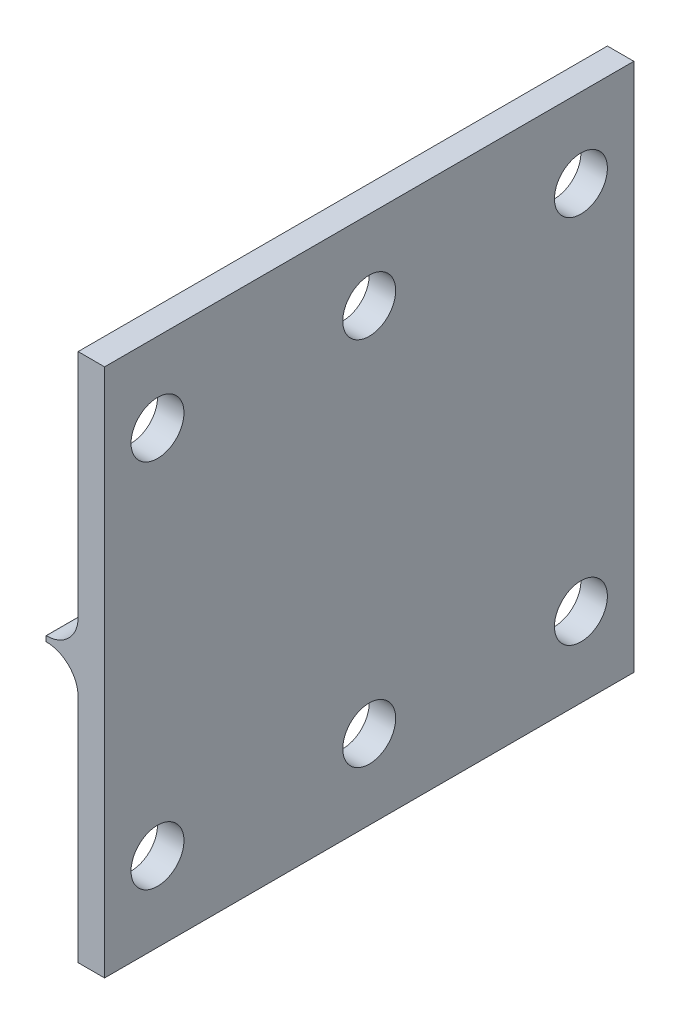
ISO-10303-21;
HEADER;
FILE_DESCRIPTION(('STEP AP214'),'2;1');
FILE_NAME('part.step','',(''),(''),'','','');
FILE_SCHEMA(('AUTOMOTIVE_DESIGN { 1 0 10303 214 1 1 1 1 }'));
ENDSEC;
DATA;
#1=APPLICATION_CONTEXT('core data for automotive mechanical design processes');
#2=APPLICATION_PROTOCOL_DEFINITION('international standard','automotive_design',2000,#1);
#3=PRODUCT_CONTEXT('',#1,'mechanical');
#4=PRODUCT('Part','Part','',(#3));
#5=PRODUCT_RELATED_PRODUCT_CATEGORY('part','',(#4));
#6=PRODUCT_DEFINITION_FORMATION('','',#4);
#7=PRODUCT_DEFINITION_CONTEXT('part definition',#1,'design');
#8=PRODUCT_DEFINITION('design','',#6,#7);
#9=PRODUCT_DEFINITION_SHAPE('','',#8);
#10=(LENGTH_UNIT() NAMED_UNIT(*) SI_UNIT(.MILLI.,.METRE.));
#11=(NAMED_UNIT(*) PLANE_ANGLE_UNIT() SI_UNIT($,.RADIAN.));
#12=(NAMED_UNIT(*) SI_UNIT($,.STERADIAN.) SOLID_ANGLE_UNIT());
#13=UNCERTAINTY_MEASURE_WITH_UNIT(LENGTH_MEASURE(1.E-05),#10,'distance_accuracy_value','');
#14=(GEOMETRIC_REPRESENTATION_CONTEXT(3) GLOBAL_UNCERTAINTY_ASSIGNED_CONTEXT((#13)) GLOBAL_UNIT_ASSIGNED_CONTEXT((#10,
#11,#12)) REPRESENTATION_CONTEXT('',''));
#15=CARTESIAN_POINT('',(0.,0.,0.));
#16=DIRECTION('',(0.,0.,1.));
#17=DIRECTION('',(1.,0.,0.));
#18=AXIS2_PLACEMENT_3D('',#15,#16,#17);
#19=CARTESIAN_POINT('',(-25.,447.529481132075,500.));
#20=DIRECTION('',(1.,0.,0.));
#21=DIRECTION('',(0.,1.,0.));
#22=AXIS2_PLACEMENT_3D('',#19,#20,#21);
#23=PLANE('',#22);
#24=CARTESIAN_POINT('',(-24.9999999999999,372.529481132073,49.999999999999));
#25=DIRECTION('',(-1.,0.,0.));
#26=DIRECTION('',(0.,0.,1.));
#27=AXIS2_PLACEMENT_3D('',#24,#25,#26);
#28=CIRCLE('',#27,25.);
#29=CARTESIAN_POINT('',(-24.9999999999999,372.529481132073,74.999999999999));
#30=VERTEX_POINT('',#29);
#31=EDGE_CURVE('E242',#30,#30,#28,.T.);
#32=ORIENTED_EDGE('',*,*,#31,.F.);
#33=EDGE_LOOP('',(#32));
#34=FACE_BOUND('',#33,.T.);
#35=CARTESIAN_POINT('',(-24.9999999999999,372.529481132074,249.999999999999));
#36=DIRECTION('',(-1.,0.,0.));
#37=DIRECTION('',(0.,0.,1.));
#38=AXIS2_PLACEMENT_3D('',#35,#36,#37);
#39=CIRCLE('',#38,25.);
#40=CARTESIAN_POINT('',(-24.9999999999999,372.529481132074,274.999999999999));
#41=VERTEX_POINT('',#40);
#42=EDGE_CURVE('E236',#41,#41,#39,.T.);
#43=ORIENTED_EDGE('',*,*,#42,.F.);
#44=EDGE_LOOP('',(#43));
#45=FACE_BOUND('',#44,.T.);
#46=CARTESIAN_POINT('',(-24.9999999999999,372.529481132075,449.999999999999));
#47=DIRECTION('',(-1.,0.,0.));
#48=DIRECTION('',(0.,0.,1.));
#49=AXIS2_PLACEMENT_3D('',#46,#47,#48);
#50=CIRCLE('',#49,25.);
#51=CARTESIAN_POINT('',(-24.9999999999999,372.529481132075,474.999999999999));
#52=VERTEX_POINT('',#51);
#53=EDGE_CURVE('E230',#52,#52,#50,.T.);
#54=ORIENTED_EDGE('',*,*,#53,.F.);
#55=EDGE_LOOP('',(#54));
#56=FACE_BOUND('',#55,.T.);
#57=DIRECTION('',(0.,-1.,0.));
#58=VECTOR('',#57,1.);
#59=CARTESIAN_POINT('',(-25.,447.529481132075,0.));
#60=LINE('',#59,#58);
#61=CARTESIAN_POINT('',(-25.,447.529481132075,0.));
#62=VERTEX_POINT('',#61);
#63=CARTESIAN_POINT('',(-25.,230.029481132075,0.));
#64=VERTEX_POINT('',#63);
#65=EDGE_CURVE('E145',#62,#64,#60,.T.);
#66=ORIENTED_EDGE('',*,*,#65,.T.);
#67=DIRECTION('',(0.,0.,-1.));
#68=VECTOR('',#67,1.);
#69=CARTESIAN_POINT('',(-25.,230.029481132075,500.));
#70=LINE('',#69,#68);
#71=CARTESIAN_POINT('',(-25.,230.029481132075,500.));
#72=VERTEX_POINT('',#71);
#73=EDGE_CURVE('E11',#72,#64,#70,.T.);
#74=ORIENTED_EDGE('',*,*,#73,.F.);
#75=DIRECTION('',(0.,-1.,0.));
#76=VECTOR('',#75,1.);
#77=CARTESIAN_POINT('',(-25.,447.529481132075,500.));
#78=LINE('',#77,#76);
#79=CARTESIAN_POINT('',(-25.,447.529481132075,500.));
#80=VERTEX_POINT('',#79);
#81=EDGE_CURVE('E165',#80,#72,#78,.T.);
#82=ORIENTED_EDGE('',*,*,#81,.F.);
#83=DIRECTION('',(0.,0.,-1.));
#84=VECTOR('',#83,1.);
#85=CARTESIAN_POINT('',(-25.,447.529481132075,500.));
#86=LINE('',#85,#84);
#87=EDGE_CURVE('E141',#80,#62,#86,.T.);
#88=ORIENTED_EDGE('',*,*,#87,.T.);
#89=EDGE_LOOP('',(#66,#74,#82,#88));
#90=FACE_BOUND('',#89,.T.);
#91=ADVANCED_FACE('F37',(#34,#45,#56,#90),#23,.F.);
#92=CARTESIAN_POINT('',(-55.,230.029481132075,500.));
#93=DIRECTION('',(0.,0.,-1.));
#94=DIRECTION('',(-1.,0.,0.));
#95=AXIS2_PLACEMENT_3D('',#92,#93,#94);
#96=CYLINDRICAL_SURFACE('',#95,30.);
#97=CARTESIAN_POINT('',(-55.,230.029481132075,0.));
#98=DIRECTION('',(0.,0.,-1.));
#99=DIRECTION('',(1.,0.,0.));
#100=AXIS2_PLACEMENT_3D('',#97,#98,#99);
#101=CIRCLE('',#100,30.);
#102=CARTESIAN_POINT('',(-55.,200.029481132075,0.));
#103=VERTEX_POINT('',#102);
#104=EDGE_CURVE('E148',#64,#103,#101,.T.);
#105=ORIENTED_EDGE('',*,*,#104,.T.);
#106=DIRECTION('',(0.,0.,-1.));
#107=VECTOR('',#106,1.);
#108=CARTESIAN_POINT('',(-55.,200.029481132075,500.));
#109=LINE('',#108,#107);
#110=CARTESIAN_POINT('',(-55.,200.029481132075,500.));
#111=VERTEX_POINT('',#110);
#112=EDGE_CURVE('E45',#111,#103,#109,.T.);
#113=ORIENTED_EDGE('',*,*,#112,.F.);
#114=CARTESIAN_POINT('',(-55.,230.029481132075,500.));
#115=DIRECTION('',(0.,0.,-1.));
#116=DIRECTION('',(1.,0.,0.));
#117=AXIS2_PLACEMENT_3D('',#114,#115,#116);
#118=CIRCLE('',#117,30.);
#119=EDGE_CURVE('E102',#72,#111,#118,.T.);
#120=ORIENTED_EDGE('',*,*,#119,.F.);
#121=ORIENTED_EDGE('',*,*,#73,.T.);
#122=EDGE_LOOP('',(#105,#113,#120,#121));
#123=FACE_BOUND('',#122,.T.);
#124=ADVANCED_FACE('F259',(#123),#96,.F.);
#125=CARTESIAN_POINT('',(-55.,200.029481132075,500.));
#126=DIRECTION('',(0.,-1.,0.));
#127=DIRECTION('',(0.,0.,-1.));
#128=AXIS2_PLACEMENT_3D('',#125,#126,#127);
#129=PLANE('',#128);
#130=DIRECTION('',(-1.,0.,0.));
#131=VECTOR('',#130,1.);
#132=CARTESIAN_POINT('',(-55.,200.029481132075,0.));
#133=LINE('',#132,#131);
#134=CARTESIAN_POINT('',(-55.1997775417419,200.029481132075,0.));
#135=VERTEX_POINT('',#134);
#136=EDGE_CURVE('E151',#103,#135,#133,.T.);
#137=ORIENTED_EDGE('',*,*,#136,.T.);
#138=DIRECTION('',(0.,0.,-1.));
#139=VECTOR('',#138,1.);
#140=CARTESIAN_POINT('',(-55.1997775417419,200.029481132075,500.));
#141=LINE('',#140,#139);
#142=CARTESIAN_POINT('',(-55.1997775417419,200.029481132075,500.));
#143=VERTEX_POINT('',#142);
#144=EDGE_CURVE('E178',#143,#135,#141,.T.);
#145=ORIENTED_EDGE('',*,*,#144,.F.);
#146=DIRECTION('',(-1.,0.,0.));
#147=VECTOR('',#146,1.);
#148=CARTESIAN_POINT('',(-55.,200.029481132075,500.));
#149=LINE('',#148,#147);
#150=EDGE_CURVE('E186',#111,#143,#149,.T.);
#151=ORIENTED_EDGE('',*,*,#150,.F.);
#152=ORIENTED_EDGE('',*,*,#112,.T.);
#153=EDGE_LOOP('',(#137,#145,#151,#152));
#154=FACE_BOUND('',#153,.T.);
#155=ADVANCED_FACE('F184',(#154),#129,.F.);
#156=CARTESIAN_POINT('',(-55.1997775417419,200.029481132075,500.));
#157=DIRECTION('',(1.,0.,0.));
#158=DIRECTION('',(0.,0.,-1.));
#159=AXIS2_PLACEMENT_3D('',#156,#157,#158);
#160=PLANE('',#159);
#161=DIRECTION('',(0.,-1.,0.));
#162=VECTOR('',#161,1.);
#163=CARTESIAN_POINT('',(-55.1997775417419,200.029481132075,0.));
#164=LINE('',#163,#162);
#165=CARTESIAN_POINT('',(-55.1997775417419,195.029481132075,0.));
#166=VERTEX_POINT('',#165);
#167=EDGE_CURVE('E153',#135,#166,#164,.T.);
#168=ORIENTED_EDGE('',*,*,#167,.T.);
#169=DIRECTION('',(0.,0.,-1.));
#170=VECTOR('',#169,1.);
#171=CARTESIAN_POINT('',(-55.1997775417419,195.029481132075,500.));
#172=LINE('',#171,#170);
#173=CARTESIAN_POINT('',(-55.1997775417419,195.029481132075,500.));
#174=VERTEX_POINT('',#173);
#175=EDGE_CURVE('E175',#174,#166,#172,.T.);
#176=ORIENTED_EDGE('',*,*,#175,.F.);
#177=DIRECTION('',(0.,-1.,0.));
#178=VECTOR('',#177,1.);
#179=CARTESIAN_POINT('',(-55.1997775417419,200.029481132075,500.));
#180=LINE('',#179,#178);
#181=EDGE_CURVE('E204',#143,#174,#180,.T.);
#182=ORIENTED_EDGE('',*,*,#181,.F.);
#183=ORIENTED_EDGE('',*,*,#144,.T.);
#184=EDGE_LOOP('',(#168,#176,#182,#183));
#185=FACE_BOUND('',#184,.T.);
#186=ADVANCED_FACE('F195',(#185),#160,.F.);
#187=CARTESIAN_POINT('',(-55.1997775417419,195.029481132075,500.));
#188=DIRECTION('',(0.,1.,0.));
#189=DIRECTION('',(0.,0.,1.));
#190=AXIS2_PLACEMENT_3D('',#187,#188,#189);
#191=PLANE('',#190);
#192=DIRECTION('',(1.,0.,0.));
#193=VECTOR('',#192,1.);
#194=CARTESIAN_POINT('',(-55.1997775417419,195.029481132075,0.));
#195=LINE('',#194,#193);
#196=CARTESIAN_POINT('',(-55.,195.029481132075,0.));
#197=VERTEX_POINT('',#196);
#198=EDGE_CURVE('E155',#166,#197,#195,.T.);
#199=ORIENTED_EDGE('',*,*,#198,.T.);
#200=DIRECTION('',(0.,0.,-1.));
#201=VECTOR('',#200,1.);
#202=CARTESIAN_POINT('',(-55.,195.029481132075,500.));
#203=LINE('',#202,#201);
#204=CARTESIAN_POINT('',(-55.,195.029481132075,500.));
#205=VERTEX_POINT('',#204);
#206=EDGE_CURVE('E172',#205,#197,#203,.T.);
#207=ORIENTED_EDGE('',*,*,#206,.F.);
#208=DIRECTION('',(1.,0.,0.));
#209=VECTOR('',#208,1.);
#210=CARTESIAN_POINT('',(-55.1997775417419,195.029481132075,500.));
#211=LINE('',#210,#209);
#212=EDGE_CURVE('E201',#174,#205,#211,.T.);
#213=ORIENTED_EDGE('',*,*,#212,.F.);
#214=ORIENTED_EDGE('',*,*,#175,.T.);
#215=EDGE_LOOP('',(#199,#207,#213,#214));
#216=FACE_BOUND('',#215,.T.);
#217=ADVANCED_FACE('F199',(#216),#191,.F.);
#218=CARTESIAN_POINT('',(-55.,165.029481132075,500.));
#219=DIRECTION('',(0.,0.,-1.));
#220=DIRECTION('',(-1.,0.,0.));
#221=AXIS2_PLACEMENT_3D('',#218,#219,#220);
#222=CYLINDRICAL_SURFACE('',#221,30.);
#223=CARTESIAN_POINT('',(-55.,165.029481132075,0.));
#224=DIRECTION('',(0.,0.,-1.));
#225=DIRECTION('',(1.,0.,0.));
#226=AXIS2_PLACEMENT_3D('',#223,#224,#225);
#227=CIRCLE('',#226,30.);
#228=CARTESIAN_POINT('',(-25.,165.029481132075,0.));
#229=VERTEX_POINT('',#228);
#230=EDGE_CURVE('E157',#197,#229,#227,.T.);
#231=ORIENTED_EDGE('',*,*,#230,.T.);
#232=DIRECTION('',(0.,0.,-1.));
#233=VECTOR('',#232,1.);
#234=CARTESIAN_POINT('',(-25.,165.029481132075,500.));
#235=LINE('',#234,#233);
#236=CARTESIAN_POINT('',(-25.,165.029481132075,500.));
#237=VERTEX_POINT('',#236);
#238=EDGE_CURVE('E169',#237,#229,#235,.T.);
#239=ORIENTED_EDGE('',*,*,#238,.F.);
#240=CARTESIAN_POINT('',(-55.,165.029481132075,500.));
#241=DIRECTION('',(0.,0.,-1.));
#242=DIRECTION('',(1.,0.,0.));
#243=AXIS2_PLACEMENT_3D('',#240,#241,#242);
#244=CIRCLE('',#243,30.);
#245=EDGE_CURVE('E203',#205,#237,#244,.T.);
#246=ORIENTED_EDGE('',*,*,#245,.F.);
#247=ORIENTED_EDGE('',*,*,#206,.T.);
#248=EDGE_LOOP('',(#231,#239,#246,#247));
#249=FACE_BOUND('',#248,.T.);
#250=ADVANCED_FACE('F269',(#249),#222,.F.);
#251=CARTESIAN_POINT('',(-24.9999999999999,0.,500.));
#252=DIRECTION('',(1.,0.,0.));
#253=DIRECTION('',(0.,0.,-1.));
#254=AXIS2_PLACEMENT_3D('',#251,#252,#253);
#255=PLANE('',#254);
#256=CARTESIAN_POINT('',(-24.9999999999999,22.5294811320727,50.0000000000002));
#257=DIRECTION('',(-1.,0.,0.));
#258=DIRECTION('',(0.,0.,1.));
#259=AXIS2_PLACEMENT_3D('',#256,#257,#258);
#260=CIRCLE('',#259,25.);
#261=CARTESIAN_POINT('',(-24.9999999999999,22.5294811320727,75.0000000000002));
#262=VERTEX_POINT('',#261);
#263=EDGE_CURVE('E224',#262,#262,#260,.T.);
#264=ORIENTED_EDGE('',*,*,#263,.F.);
#265=EDGE_LOOP('',(#264));
#266=FACE_BOUND('',#265,.T.);
#267=CARTESIAN_POINT('',(-24.9999999999999,22.5294811320741,250.));
#268=DIRECTION('',(-1.,0.,0.));
#269=DIRECTION('',(0.,0.,1.));
#270=AXIS2_PLACEMENT_3D('',#267,#268,#269);
#271=CIRCLE('',#270,25.);
#272=CARTESIAN_POINT('',(-24.9999999999999,22.5294811320741,275.));
#273=VERTEX_POINT('',#272);
#274=EDGE_CURVE('E218',#273,#273,#271,.T.);
#275=ORIENTED_EDGE('',*,*,#274,.F.);
#276=EDGE_LOOP('',(#275));
#277=FACE_BOUND('',#276,.T.);
#278=CARTESIAN_POINT('',(-24.9999999999999,22.5294811320755,450.));
#279=DIRECTION('',(-1.,0.,0.));
#280=DIRECTION('',(0.,0.,1.));
#281=AXIS2_PLACEMENT_3D('',#278,#279,#280);
#282=CIRCLE('',#281,25.);
#283=CARTESIAN_POINT('',(-24.9999999999999,22.5294811320755,475.));
#284=VERTEX_POINT('',#283);
#285=EDGE_CURVE('E212',#284,#284,#282,.T.);
#286=ORIENTED_EDGE('',*,*,#285,.F.);
#287=EDGE_LOOP('',(#286));
#288=FACE_BOUND('',#287,.T.);
#289=DIRECTION('',(0.,-1.,0.));
#290=VECTOR('',#289,1.);
#291=CARTESIAN_POINT('',(-24.9999999999999,0.,0.));
#292=LINE('',#291,#290);
#293=CARTESIAN_POINT('',(-24.9999999999999,-52.4705188679245,0.));
#294=VERTEX_POINT('',#293);
#295=EDGE_CURVE('E160',#229,#294,#292,.T.);
#296=ORIENTED_EDGE('',*,*,#295,.T.);
#297=DIRECTION('',(0.,0.,-1.));
#298=VECTOR('',#297,1.);
#299=CARTESIAN_POINT('',(-24.9999999999999,-52.4705188679245,500.));
#300=LINE('',#299,#298);
#301=CARTESIAN_POINT('',(-24.9999999999999,-52.4705188679245,500.));
#302=VERTEX_POINT('',#301);
#303=EDGE_CURVE('E136',#302,#294,#300,.T.);
#304=ORIENTED_EDGE('',*,*,#303,.F.);
#305=DIRECTION('',(0.,-1.,0.));
#306=VECTOR('',#305,1.);
#307=CARTESIAN_POINT('',(-25.,165.029481132075,500.));
#308=LINE('',#307,#306);
#309=EDGE_CURVE('E127',#237,#302,#308,.T.);
#310=ORIENTED_EDGE('',*,*,#309,.F.);
#311=ORIENTED_EDGE('',*,*,#238,.T.);
#312=EDGE_LOOP('',(#296,#304,#310,#311));
#313=FACE_BOUND('',#312,.T.);
#314=ADVANCED_FACE('F270',(#266,#277,#288,#313),#255,.F.);
#315=CARTESIAN_POINT('',(-24.9999999999999,-52.4705188679245,500.));
#316=DIRECTION('',(0.,1.,0.));
#317=DIRECTION('',(0.,0.,1.));
#318=AXIS2_PLACEMENT_3D('',#315,#316,#317);
#319=PLANE('',#318);
#320=DIRECTION('',(1.,0.,0.));
#321=VECTOR('',#320,1.);
#322=CARTESIAN_POINT('',(-24.9999999999999,-52.4705188679245,0.));
#323=LINE('',#322,#321);
#324=CARTESIAN_POINT('',(0.,-52.4705188679245,0.));
#325=VERTEX_POINT('',#324);
#326=EDGE_CURVE('E135',#294,#325,#323,.T.);
#327=ORIENTED_EDGE('',*,*,#326,.T.);
#328=DIRECTION('',(0.,0.,-1.));
#329=VECTOR('',#328,1.);
#330=CARTESIAN_POINT('',(0.,-52.4705188679245,500.));
#331=LINE('',#330,#329);
#332=CARTESIAN_POINT('',(0.,-52.4705188679245,500.));
#333=VERTEX_POINT('',#332);
#334=EDGE_CURVE('E132',#333,#325,#331,.T.);
#335=ORIENTED_EDGE('',*,*,#334,.F.);
#336=DIRECTION('',(1.,0.,0.));
#337=VECTOR('',#336,1.);
#338=CARTESIAN_POINT('',(-24.9999999999999,-52.4705188679245,500.));
#339=LINE('',#338,#337);
#340=EDGE_CURVE('E121',#302,#333,#339,.T.);
#341=ORIENTED_EDGE('',*,*,#340,.F.);
#342=ORIENTED_EDGE('',*,*,#303,.T.);
#343=EDGE_LOOP('',(#327,#335,#341,#342));
#344=FACE_BOUND('',#343,.T.);
#345=ADVANCED_FACE('F133',(#344),#319,.F.);
#346=CARTESIAN_POINT('',(0.,447.529481132075,500.));
#347=DIRECTION('',(-1.,0.,0.));
#348=DIRECTION('',(0.,-1.,0.));
#349=AXIS2_PLACEMENT_3D('',#346,#347,#348);
#350=PLANE('',#349);
#351=CARTESIAN_POINT('',(0.,372.529481132073,49.999999999999));
#352=DIRECTION('',(-1.,0.,0.));
#353=DIRECTION('',(0.,0.,1.));
#354=AXIS2_PLACEMENT_3D('',#351,#352,#353);
#355=CIRCLE('',#354,25.);
#356=CARTESIAN_POINT('',(0.,372.529481132073,74.999999999999));
#357=VERTEX_POINT('',#356);
#358=EDGE_CURVE('E239',#357,#357,#355,.T.);
#359=ORIENTED_EDGE('',*,*,#358,.T.);
#360=EDGE_LOOP('',(#359));
#361=FACE_BOUND('',#360,.T.);
#362=CARTESIAN_POINT('',(0.,372.529481132074,249.999999999999));
#363=DIRECTION('',(-1.,0.,0.));
#364=DIRECTION('',(0.,0.,1.));
#365=AXIS2_PLACEMENT_3D('',#362,#363,#364);
#366=CIRCLE('',#365,25.);
#367=CARTESIAN_POINT('',(0.,372.529481132074,274.999999999999));
#368=VERTEX_POINT('',#367);
#369=EDGE_CURVE('E233',#368,#368,#366,.T.);
#370=ORIENTED_EDGE('',*,*,#369,.T.);
#371=EDGE_LOOP('',(#370));
#372=FACE_BOUND('',#371,.T.);
#373=CARTESIAN_POINT('',(0.,372.529481132075,449.999999999999));
#374=DIRECTION('',(-1.,0.,0.));
#375=DIRECTION('',(0.,0.,1.));
#376=AXIS2_PLACEMENT_3D('',#373,#374,#375);
#377=CIRCLE('',#376,25.);
#378=CARTESIAN_POINT('',(0.,372.529481132075,474.999999999999));
#379=VERTEX_POINT('',#378);
#380=EDGE_CURVE('E227',#379,#379,#377,.T.);
#381=ORIENTED_EDGE('',*,*,#380,.T.);
#382=EDGE_LOOP('',(#381));
#383=FACE_BOUND('',#382,.T.);
#384=CARTESIAN_POINT('',(0.,22.5294811320727,50.0000000000002));
#385=DIRECTION('',(-1.,0.,0.));
#386=DIRECTION('',(0.,0.,1.));
#387=AXIS2_PLACEMENT_3D('',#384,#385,#386);
#388=CIRCLE('',#387,25.);
#389=CARTESIAN_POINT('',(0.,22.5294811320727,75.0000000000002));
#390=VERTEX_POINT('',#389);
#391=EDGE_CURVE('E221',#390,#390,#388,.T.);
#392=ORIENTED_EDGE('',*,*,#391,.T.);
#393=EDGE_LOOP('',(#392));
#394=FACE_BOUND('',#393,.T.);
#395=CARTESIAN_POINT('',(0.,22.5294811320741,250.));
#396=DIRECTION('',(-1.,0.,0.));
#397=DIRECTION('',(0.,0.,1.));
#398=AXIS2_PLACEMENT_3D('',#395,#396,#397);
#399=CIRCLE('',#398,25.);
#400=CARTESIAN_POINT('',(0.,22.5294811320741,275.));
#401=VERTEX_POINT('',#400);
#402=EDGE_CURVE('E215',#401,#401,#399,.T.);
#403=ORIENTED_EDGE('',*,*,#402,.T.);
#404=EDGE_LOOP('',(#403));
#405=FACE_BOUND('',#404,.T.);
#406=CARTESIAN_POINT('',(0.,22.5294811320755,450.));
#407=DIRECTION('',(-1.,0.,0.));
#408=DIRECTION('',(0.,0.,1.));
#409=AXIS2_PLACEMENT_3D('',#406,#407,#408);
#410=CIRCLE('',#409,25.);
#411=CARTESIAN_POINT('',(0.,22.5294811320755,475.));
#412=VERTEX_POINT('',#411);
#413=EDGE_CURVE('E149',#412,#412,#410,.T.);
#414=ORIENTED_EDGE('',*,*,#413,.T.);
#415=EDGE_LOOP('',(#414));
#416=FACE_BOUND('',#415,.T.);
#417=DIRECTION('',(0.,1.,0.));
#418=VECTOR('',#417,1.);
#419=CARTESIAN_POINT('',(0.,447.529481132075,0.));
#420=LINE('',#419,#418);
#421=CARTESIAN_POINT('',(0.,447.529481132075,0.));
#422=VERTEX_POINT('',#421);
#423=EDGE_CURVE('E88',#325,#422,#420,.T.);
#424=ORIENTED_EDGE('',*,*,#423,.T.);
#425=DIRECTION('',(0.,0.,-1.));
#426=VECTOR('',#425,1.);
#427=CARTESIAN_POINT('',(0.,447.529481132075,500.));
#428=LINE('',#427,#426);
#429=CARTESIAN_POINT('',(0.,447.529481132075,500.));
#430=VERTEX_POINT('',#429);
#431=EDGE_CURVE('E137',#430,#422,#428,.T.);
#432=ORIENTED_EDGE('',*,*,#431,.F.);
#433=DIRECTION('',(0.,1.,0.));
#434=VECTOR('',#433,1.);
#435=CARTESIAN_POINT('',(0.,447.529481132075,500.));
#436=LINE('',#435,#434);
#437=EDGE_CURVE('E125',#333,#430,#436,.T.);
#438=ORIENTED_EDGE('',*,*,#437,.F.);
#439=ORIENTED_EDGE('',*,*,#334,.T.);
#440=EDGE_LOOP('',(#424,#432,#438,#439));
#441=FACE_BOUND('',#440,.T.);
#442=ADVANCED_FACE('F139',(#361,#372,#383,#394,#405,#416,#441),#350,.F.);
#443=CARTESIAN_POINT('',(-25.,447.529481132075,500.));
#444=DIRECTION('',(0.,-1.,0.));
#445=DIRECTION('',(0.,0.,-1.));
#446=AXIS2_PLACEMENT_3D('',#443,#444,#445);
#447=PLANE('',#446);
#448=DIRECTION('',(-1.,0.,0.));
#449=VECTOR('',#448,1.);
#450=CARTESIAN_POINT('',(-25.,447.529481132075,0.));
#451=LINE('',#450,#449);
#452=EDGE_CURVE('E94',#422,#62,#451,.T.);
#453=ORIENTED_EDGE('',*,*,#452,.T.);
#454=ORIENTED_EDGE('',*,*,#87,.F.);
#455=DIRECTION('',(-1.,0.,0.));
#456=VECTOR('',#455,1.);
#457=CARTESIAN_POINT('',(-25.,447.529481132075,500.));
#458=LINE('',#457,#456);
#459=EDGE_CURVE('E53',#430,#80,#458,.T.);
#460=ORIENTED_EDGE('',*,*,#459,.F.);
#461=ORIENTED_EDGE('',*,*,#431,.T.);
#462=EDGE_LOOP('',(#453,#454,#460,#461));
#463=FACE_BOUND('',#462,.T.);
#464=ADVANCED_FACE('F327',(#463),#447,.F.);
#465=CARTESIAN_POINT('',(-55.,230.029481132075,500.));
#466=DIRECTION('',(0.,0.,1.));
#467=DIRECTION('',(1.,0.,0.));
#468=AXIS2_PLACEMENT_3D('',#465,#466,#467);
#469=PLANE('',#468);
#470=ORIENTED_EDGE('',*,*,#81,.T.);
#471=ORIENTED_EDGE('',*,*,#119,.T.);
#472=ORIENTED_EDGE('',*,*,#150,.T.);
#473=ORIENTED_EDGE('',*,*,#181,.T.);
#474=ORIENTED_EDGE('',*,*,#212,.T.);
#475=ORIENTED_EDGE('',*,*,#245,.T.);
#476=ORIENTED_EDGE('',*,*,#309,.T.);
#477=ORIENTED_EDGE('',*,*,#340,.T.);
#478=ORIENTED_EDGE('',*,*,#437,.T.);
#479=ORIENTED_EDGE('',*,*,#459,.T.);
#480=EDGE_LOOP('',(#470,#471,#472,#473,#474,#475,#476,#477,#478,#479));
#481=FACE_BOUND('',#480,.T.);
#482=ADVANCED_FACE('F123',(#481),#469,.T.);
#483=CARTESIAN_POINT('',(-55.,230.029481132075,0.));
#484=DIRECTION('',(0.,0.,1.));
#485=DIRECTION('',(1.,0.,0.));
#486=AXIS2_PLACEMENT_3D('',#483,#484,#485);
#487=PLANE('',#486);
#488=ORIENTED_EDGE('',*,*,#65,.F.);
#489=ORIENTED_EDGE('',*,*,#452,.F.);
#490=ORIENTED_EDGE('',*,*,#423,.F.);
#491=ORIENTED_EDGE('',*,*,#326,.F.);
#492=ORIENTED_EDGE('',*,*,#295,.F.);
#493=ORIENTED_EDGE('',*,*,#230,.F.);
#494=ORIENTED_EDGE('',*,*,#198,.F.);
#495=ORIENTED_EDGE('',*,*,#167,.F.);
#496=ORIENTED_EDGE('',*,*,#136,.F.);
#497=ORIENTED_EDGE('',*,*,#104,.F.);
#498=EDGE_LOOP('',(#488,#489,#490,#491,#492,#493,#494,#495,#496,#497));
#499=FACE_BOUND('',#498,.T.);
#500=ADVANCED_FACE('F190',(#499),#487,.F.);
#501=CARTESIAN_POINT('',(0.,22.5294811320755,450.));
#502=DIRECTION('',(-1.,0.,0.));
#503=DIRECTION('',(0.,0.,1.));
#504=AXIS2_PLACEMENT_3D('',#501,#502,#503);
#505=CYLINDRICAL_SURFACE('',#504,25.);
#506=ORIENTED_EDGE('',*,*,#413,.F.);
#507=EDGE_LOOP('',(#506));
#508=FACE_BOUND('',#507,.T.);
#509=ORIENTED_EDGE('',*,*,#285,.T.);
#510=EDGE_LOOP('',(#509));
#511=FACE_BOUND('',#510,.T.);
#512=ADVANCED_FACE('F349',(#508,#511),#505,.F.);
#513=CARTESIAN_POINT('',(0.,22.5294811320741,250.));
#514=DIRECTION('',(-1.,0.,0.));
#515=DIRECTION('',(0.,0.,1.));
#516=AXIS2_PLACEMENT_3D('',#513,#514,#515);
#517=CYLINDRICAL_SURFACE('',#516,25.);
#518=ORIENTED_EDGE('',*,*,#402,.F.);
#519=EDGE_LOOP('',(#518));
#520=FACE_BOUND('',#519,.T.);
#521=ORIENTED_EDGE('',*,*,#274,.T.);
#522=EDGE_LOOP('',(#521));
#523=FACE_BOUND('',#522,.T.);
#524=ADVANCED_FACE('F374',(#520,#523),#517,.F.);
#525=CARTESIAN_POINT('',(0.,22.5294811320727,50.0000000000002));
#526=DIRECTION('',(-1.,0.,0.));
#527=DIRECTION('',(0.,0.,1.));
#528=AXIS2_PLACEMENT_3D('',#525,#526,#527);
#529=CYLINDRICAL_SURFACE('',#528,25.);
#530=ORIENTED_EDGE('',*,*,#391,.F.);
#531=EDGE_LOOP('',(#530));
#532=FACE_BOUND('',#531,.T.);
#533=ORIENTED_EDGE('',*,*,#263,.T.);
#534=EDGE_LOOP('',(#533));
#535=FACE_BOUND('',#534,.T.);
#536=ADVANCED_FACE('F385',(#532,#535),#529,.F.);
#537=CARTESIAN_POINT('',(0.,372.529481132075,449.999999999999));
#538=DIRECTION('',(-1.,0.,0.));
#539=DIRECTION('',(0.,0.,1.));
#540=AXIS2_PLACEMENT_3D('',#537,#538,#539);
#541=CYLINDRICAL_SURFACE('',#540,25.);
#542=ORIENTED_EDGE('',*,*,#380,.F.);
#543=EDGE_LOOP('',(#542));
#544=FACE_BOUND('',#543,.T.);
#545=ORIENTED_EDGE('',*,*,#53,.T.);
#546=EDGE_LOOP('',(#545));
#547=FACE_BOUND('',#546,.T.);
#548=ADVANCED_FACE('F396',(#544,#547),#541,.F.);
#549=CARTESIAN_POINT('',(0.,372.529481132074,249.999999999999));
#550=DIRECTION('',(-1.,0.,0.));
#551=DIRECTION('',(0.,0.,1.));
#552=AXIS2_PLACEMENT_3D('',#549,#550,#551);
#553=CYLINDRICAL_SURFACE('',#552,25.);
#554=ORIENTED_EDGE('',*,*,#369,.F.);
#555=EDGE_LOOP('',(#554));
#556=FACE_BOUND('',#555,.T.);
#557=ORIENTED_EDGE('',*,*,#42,.T.);
#558=EDGE_LOOP('',(#557));
#559=FACE_BOUND('',#558,.T.);
#560=ADVANCED_FACE('F253',(#556,#559),#553,.F.);
#561=CARTESIAN_POINT('',(0.,372.529481132073,49.999999999999));
#562=DIRECTION('',(-1.,0.,0.));
#563=DIRECTION('',(0.,0.,1.));
#564=AXIS2_PLACEMENT_3D('',#561,#562,#563);
#565=CYLINDRICAL_SURFACE('',#564,25.);
#566=ORIENTED_EDGE('',*,*,#358,.F.);
#567=EDGE_LOOP('',(#566));
#568=FACE_BOUND('',#567,.T.);
#569=ORIENTED_EDGE('',*,*,#31,.T.);
#570=EDGE_LOOP('',(#569));
#571=FACE_BOUND('',#570,.T.);
#572=ADVANCED_FACE('F250',(#568,#571),#565,.F.);
#573=CLOSED_SHELL('',(#91,#124,#155,#186,#217,#250,#314,#345,#442,#464,#482,#500,#512,#524,#536,
#548,#560,#572));
#574=MANIFOLD_SOLID_BREP('B2',#573);
#575=ADVANCED_BREP_SHAPE_REPRESENTATION('',(#18,#574),#14);
#576=SHAPE_DEFINITION_REPRESENTATION(#9,#575);
ENDSEC;
END-ISO-10303-21;
